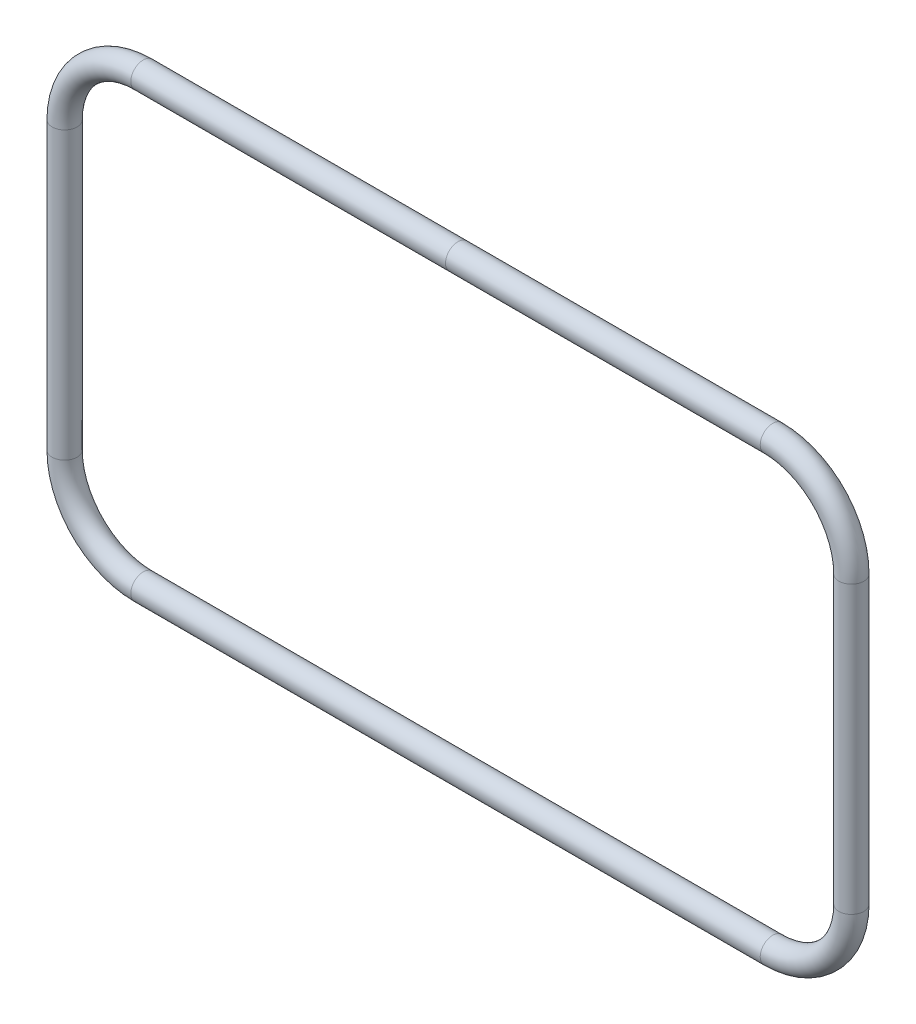
ISO-10303-21;
HEADER;
FILE_DESCRIPTION(('STEP AP214'),'2;1');
FILE_NAME('part.step','',(''),(''),'','','');
FILE_SCHEMA(('AUTOMOTIVE_DESIGN { 1 0 10303 214 1 1 1 1 }'));
ENDSEC;
DATA;
#1=APPLICATION_CONTEXT('core data for automotive mechanical design processes');
#2=APPLICATION_PROTOCOL_DEFINITION('international standard','automotive_design',2000,#1);
#3=PRODUCT_CONTEXT('',#1,'mechanical');
#4=PRODUCT('Part','Part','',(#3));
#5=PRODUCT_RELATED_PRODUCT_CATEGORY('part','',(#4));
#6=PRODUCT_DEFINITION_FORMATION('','',#4);
#7=PRODUCT_DEFINITION_CONTEXT('part definition',#1,'design');
#8=PRODUCT_DEFINITION('design','',#6,#7);
#9=PRODUCT_DEFINITION_SHAPE('','',#8);
#10=(LENGTH_UNIT() NAMED_UNIT(*) SI_UNIT(.MILLI.,.METRE.));
#11=(NAMED_UNIT(*) PLANE_ANGLE_UNIT() SI_UNIT($,.RADIAN.));
#12=(NAMED_UNIT(*) SI_UNIT($,.STERADIAN.) SOLID_ANGLE_UNIT());
#13=UNCERTAINTY_MEASURE_WITH_UNIT(LENGTH_MEASURE(1.E-05),#10,'distance_accuracy_value','');
#14=(GEOMETRIC_REPRESENTATION_CONTEXT(3) GLOBAL_UNCERTAINTY_ASSIGNED_CONTEXT((#13)) GLOBAL_UNIT_ASSIGNED_CONTEXT((#10,
#11,#12)) REPRESENTATION_CONTEXT('',''));
#15=CARTESIAN_POINT('',(0.,0.,0.));
#16=DIRECTION('',(0.,0.,1.));
#17=DIRECTION('',(1.,0.,0.));
#18=AXIS2_PLACEMENT_3D('',#15,#16,#17);
#19=CARTESIAN_POINT('',(-120.,84.525,0.));
#20=DIRECTION('',(1.,0.,0.));
#21=DIRECTION('',(0.,1.,0.));
#22=AXIS2_PLACEMENT_3D('',#19,#20,#21);
#23=CYLINDRICAL_SURFACE('',#22,4.76249999999999);
#24=CARTESIAN_POINT('',(0.,84.525,0.));
#25=DIRECTION('',(1.,0.,0.));
#26=DIRECTION('',(0.,0.,-1.));
#27=AXIS2_PLACEMENT_3D('',#24,#25,#26);
#28=CIRCLE('',#27,4.76249999999999);
#29=CARTESIAN_POINT('',(0.,84.525,-4.76249999999999));
#30=VERTEX_POINT('',#29);
#31=EDGE_CURVE('E62',#30,#30,#28,.T.);
#32=ORIENTED_EDGE('',*,*,#31,.F.);
#33=EDGE_LOOP('',(#32));
#34=FACE_BOUND('',#33,.T.);
#35=CARTESIAN_POINT('',(-120.,84.525,0.));
#36=DIRECTION('',(1.,0.,0.));
#37=DIRECTION('',(0.,0.,-1.));
#38=AXIS2_PLACEMENT_3D('',#35,#36,#37);
#39=CIRCLE('',#38,4.76249999999999);
#40=CARTESIAN_POINT('',(-120.,89.2875000000001,0.));
#41=VERTEX_POINT('',#40);
#42=EDGE_CURVE('E10',#41,#41,#39,.T.);
#43=ORIENTED_EDGE('',*,*,#42,.T.);
#44=EDGE_LOOP('',(#43));
#45=FACE_BOUND('',#44,.T.);
#46=ADVANCED_FACE('F31',(#34,#45),#23,.T.);
#47=CARTESIAN_POINT('',(-120.,54.525,0.));
#48=DIRECTION('',(0.,0.,-1.));
#49=DIRECTION('',(-1.,0.,0.));
#50=AXIS2_PLACEMENT_3D('',#47,#48,#49);
#51=TOROIDAL_SURFACE('',#50,30.,4.76249999999999);
#52=CARTESIAN_POINT('',(-150.,54.5249999999999,0.));
#53=DIRECTION('',(0.,1.,0.));
#54=DIRECTION('',(0.,0.,-1.));
#55=AXIS2_PLACEMENT_3D('',#52,#53,#54);
#56=CIRCLE('',#55,4.76249999999999);
#57=CARTESIAN_POINT('',(-154.7625,54.5249999999999,0.));
#58=VERTEX_POINT('',#57);
#59=EDGE_CURVE('E37',#58,#58,#56,.T.);
#60=CARTESIAN_POINT('',(-120.,54.525,0.));
#61=DIRECTION('',(0.,0.,-1.));
#62=DIRECTION('',(-1.,0.,0.));
#63=AXIS2_PLACEMENT_3D('',#60,#61,#62);
#64=CIRCLE('',#63,34.7625);
#65=EDGE_CURVE('',#58,#41,#64,.T.);
#66=ORIENTED_EDGE('',*,*,#59,.T.);
#67=ORIENTED_EDGE('',*,*,#42,.F.);
#68=ORIENTED_EDGE('',*,*,#65,.T.);
#69=ORIENTED_EDGE('',*,*,#65,.F.);
#70=EDGE_LOOP('',(#66,#68,#67,#69));
#71=FACE_BOUND('',#70,.T.);
#72=ADVANCED_FACE('F69',(#71),#51,.T.);
#73=CARTESIAN_POINT('',(-150.,-54.5250000000001,0.));
#74=DIRECTION('',(0.,1.,0.));
#75=DIRECTION('',(0.,0.,1.));
#76=AXIS2_PLACEMENT_3D('',#73,#74,#75);
#77=CYLINDRICAL_SURFACE('',#76,4.76249999999999);
#78=ORIENTED_EDGE('',*,*,#59,.F.);
#79=EDGE_LOOP('',(#78));
#80=FACE_BOUND('',#79,.T.);
#81=CARTESIAN_POINT('',(-150.,-54.5250000000001,0.));
#82=DIRECTION('',(0.,1.,0.));
#83=DIRECTION('',(0.,0.,-1.));
#84=AXIS2_PLACEMENT_3D('',#81,#82,#83);
#85=CIRCLE('',#84,4.76249999999999);
#86=CARTESIAN_POINT('',(-154.7625,-54.5250000000001,0.));
#87=VERTEX_POINT('',#86);
#88=EDGE_CURVE('E41',#87,#87,#85,.T.);
#89=ORIENTED_EDGE('',*,*,#88,.T.);
#90=EDGE_LOOP('',(#89));
#91=FACE_BOUND('',#90,.T.);
#92=ADVANCED_FACE('F73',(#80,#91),#77,.T.);
#93=CARTESIAN_POINT('',(-120.,-54.525,0.));
#94=DIRECTION('',(0.,0.,-1.));
#95=DIRECTION('',(-1.,0.,0.));
#96=AXIS2_PLACEMENT_3D('',#93,#94,#95);
#97=TOROIDAL_SURFACE('',#96,30.,4.76249999999999);
#98=CARTESIAN_POINT('',(-120.,-84.525,0.));
#99=DIRECTION('',(-1.,0.,0.));
#100=DIRECTION('',(0.,0.,-1.));
#101=AXIS2_PLACEMENT_3D('',#98,#99,#100);
#102=CIRCLE('',#101,4.76249999999999);
#103=CARTESIAN_POINT('',(-120.,-89.2875,0.));
#104=VERTEX_POINT('',#103);
#105=EDGE_CURVE('E45',#104,#104,#102,.T.);
#106=CARTESIAN_POINT('',(-120.,-54.525,0.));
#107=DIRECTION('',(0.,0.,-1.));
#108=DIRECTION('',(-1.,0.,0.));
#109=AXIS2_PLACEMENT_3D('',#106,#107,#108);
#110=CIRCLE('',#109,34.7625);
#111=EDGE_CURVE('',#104,#87,#110,.T.);
#112=ORIENTED_EDGE('',*,*,#105,.T.);
#113=ORIENTED_EDGE('',*,*,#88,.F.);
#114=ORIENTED_EDGE('',*,*,#111,.T.);
#115=ORIENTED_EDGE('',*,*,#111,.F.);
#116=EDGE_LOOP('',(#112,#114,#113,#115));
#117=FACE_BOUND('',#116,.T.);
#118=ADVANCED_FACE('F78',(#117),#97,.T.);
#119=CARTESIAN_POINT('',(120.,-84.525,0.));
#120=DIRECTION('',(-1.,0.,0.));
#121=DIRECTION('',(0.,-1.,0.));
#122=AXIS2_PLACEMENT_3D('',#119,#120,#121);
#123=CYLINDRICAL_SURFACE('',#122,4.76249999999999);
#124=CARTESIAN_POINT('',(120.,-84.5249999999999,0.));
#125=DIRECTION('',(-1.,0.,0.));
#126=DIRECTION('',(0.,0.,-1.));
#127=AXIS2_PLACEMENT_3D('',#124,#125,#126);
#128=CIRCLE('',#127,4.76249999999999);
#129=CARTESIAN_POINT('',(120.,-89.2875,0.));
#130=VERTEX_POINT('',#129);
#131=EDGE_CURVE('E50',#130,#130,#128,.T.);
#132=CARTESIAN_POINT('',(-120.,-89.2875,0.));
#133=CARTESIAN_POINT('',(-117.5,-89.2875,0.));
#134=CARTESIAN_POINT('',(-115.,-89.2875,0.));
#135=CARTESIAN_POINT('',(-110.,-89.2875,0.));
#136=CARTESIAN_POINT('',(-107.5,-89.2875,0.));
#137=CARTESIAN_POINT('',(-102.5,-89.2875,0.));
#138=CARTESIAN_POINT('',(-99.9999999999999,-89.2875,0.));
#139=CARTESIAN_POINT('',(-94.9999999999999,-89.2875,0.));
#140=CARTESIAN_POINT('',(-92.4999999999999,-89.2875,0.));
#141=CARTESIAN_POINT('',(-87.4999999999999,-89.2875,0.));
#142=CARTESIAN_POINT('',(-84.9999999999999,-89.2875,0.));
#143=CARTESIAN_POINT('',(-79.9999999999999,-89.2875,0.));
#144=CARTESIAN_POINT('',(-77.4999999999999,-89.2875,0.));
#145=CARTESIAN_POINT('',(-72.4999999999999,-89.2875,0.));
#146=CARTESIAN_POINT('',(-69.9999999999999,-89.2875,0.));
#147=CARTESIAN_POINT('',(-64.9999999999999,-89.2875,0.));
#148=CARTESIAN_POINT('',(-62.4999999999999,-89.2875,0.));
#149=CARTESIAN_POINT('',(-57.4999999999999,-89.2875,0.));
#150=CARTESIAN_POINT('',(-54.9999999999999,-89.2875,0.));
#151=CARTESIAN_POINT('',(-49.9999999999999,-89.2875,0.));
#152=CARTESIAN_POINT('',(-47.4999999999999,-89.2875,0.));
#153=CARTESIAN_POINT('',(-42.4999999999999,-89.2875,0.));
#154=CARTESIAN_POINT('',(-39.9999999999999,-89.2875,0.));
#155=CARTESIAN_POINT('',(-35.,-89.2875,0.));
#156=CARTESIAN_POINT('',(-32.4999999999999,-89.2875,0.));
#157=CARTESIAN_POINT('',(-27.4999999999999,-89.2875,0.));
#158=CARTESIAN_POINT('',(-24.9999999999999,-89.2875,0.));
#159=CARTESIAN_POINT('',(-19.9999999999999,-89.2875,0.));
#160=CARTESIAN_POINT('',(-17.4999999999999,-89.2875,0.));
#161=CARTESIAN_POINT('',(-12.4999999999999,-89.2875,0.));
#162=CARTESIAN_POINT('',(-9.99999999999993,-89.2875,0.));
#163=CARTESIAN_POINT('',(-4.99999999999994,-89.2875,0.));
#164=CARTESIAN_POINT('',(-2.49999999999995,-89.2875,0.));
#165=CARTESIAN_POINT('',(2.50000000000004,-89.2875,0.));
#166=CARTESIAN_POINT('',(5.00000000000005,-89.2875,0.));
#167=CARTESIAN_POINT('',(10.,-89.2875,0.));
#168=CARTESIAN_POINT('',(12.5,-89.2875,0.));
#169=CARTESIAN_POINT('',(17.5,-89.2875,0.));
#170=CARTESIAN_POINT('',(20.,-89.2875,0.));
#171=CARTESIAN_POINT('',(25.,-89.2875,0.));
#172=CARTESIAN_POINT('',(27.5,-89.2875,0.));
#173=CARTESIAN_POINT('',(32.5,-89.2875,0.));
#174=CARTESIAN_POINT('',(35.,-89.2875,0.));
#175=CARTESIAN_POINT('',(40.,-89.2875,0.));
#176=CARTESIAN_POINT('',(42.5,-89.2875,0.));
#177=CARTESIAN_POINT('',(47.5,-89.2875,0.));
#178=CARTESIAN_POINT('',(50.,-89.2875,0.));
#179=CARTESIAN_POINT('',(55.,-89.2875,0.));
#180=CARTESIAN_POINT('',(57.5,-89.2875,0.));
#181=CARTESIAN_POINT('',(62.5,-89.2875,0.));
#182=CARTESIAN_POINT('',(65.,-89.2875,0.));
#183=CARTESIAN_POINT('',(70.,-89.2875,0.));
#184=CARTESIAN_POINT('',(72.5,-89.2875,0.));
#185=CARTESIAN_POINT('',(77.5,-89.2875,0.));
#186=CARTESIAN_POINT('',(80.,-89.2875,0.));
#187=CARTESIAN_POINT('',(85.,-89.2875,0.));
#188=CARTESIAN_POINT('',(87.5,-89.2875,0.));
#189=CARTESIAN_POINT('',(92.5,-89.2875,0.));
#190=CARTESIAN_POINT('',(95.,-89.2875,0.));
#191=CARTESIAN_POINT('',(100.,-89.2875,0.));
#192=CARTESIAN_POINT('',(102.5,-89.2875,0.));
#193=CARTESIAN_POINT('',(107.5,-89.2875,0.));
#194=CARTESIAN_POINT('',(110.,-89.2875,0.));
#195=CARTESIAN_POINT('',(115.,-89.2875,0.));
#196=CARTESIAN_POINT('',(117.5,-89.2875,0.));
#197=CARTESIAN_POINT('',(120.,-89.2875,0.));
#198=B_SPLINE_CURVE_WITH_KNOTS('',3,(#132,#133,#134,#135,#136,#137,#138,#139,#140,#141,#142,
#143,#144,#145,#146,#147,#148,#149,#150,#151,#152,#153,#154,#155,#156,#157,#158,#159,#160,#161,
#162,#163,#164,#165,#166,#167,#168,#169,#170,#171,#172,#173,#174,#175,#176,#177,#178,#179,#180,
#181,#182,#183,#184,#185,#186,#187,#188,#189,#190,#191,#192,#193,#194,#195,#196,#197),
.UNSPECIFIED.,.F.,.F.,(4,2,2,2,2,2,2,2,2,2,2,2,2,2,2,2,2,2,2,2,2,2,2,2,2,2,2,2,2,2,2,2,4),(0.,
7.50000000000001,15.,22.5,30.,37.5,45.,52.5,60.,67.5,75.,82.5,90.,97.5,105.,112.5,120.,127.5,
135.,142.5,150.,157.5,165.,172.5,180.,187.5,195.,202.5,210.,217.5,225.,232.5,240.),.UNSPECIFIED.);
#199=EDGE_CURVE('BSEAM84',#104,#130,#198,.T.);
#200=ORIENTED_EDGE('',*,*,#105,.F.);
#201=ORIENTED_EDGE('',*,*,#131,.T.);
#202=ORIENTED_EDGE('',*,*,#199,.T.);
#203=ORIENTED_EDGE('',*,*,#199,.F.);
#204=EDGE_LOOP('',(#200,#202,#201,#203));
#205=FACE_BOUND('',#204,.T.);
#206=ADVANCED_FACE('F84',(#205),#123,.T.);
#207=CARTESIAN_POINT('',(120.,-54.525,0.));
#208=DIRECTION('',(0.,0.,-1.));
#209=DIRECTION('',(-1.,0.,0.));
#210=AXIS2_PLACEMENT_3D('',#207,#208,#209);
#211=TOROIDAL_SURFACE('',#210,30.,4.76249999999999);
#212=CARTESIAN_POINT('',(150.,-54.5249999999999,0.));
#213=DIRECTION('',(0.,-1.,0.));
#214=DIRECTION('',(0.,0.,-1.));
#215=AXIS2_PLACEMENT_3D('',#212,#213,#214);
#216=CIRCLE('',#215,4.76249999999999);
#217=CARTESIAN_POINT('',(154.7625,-54.5249999999999,0.));
#218=VERTEX_POINT('',#217);
#219=EDGE_CURVE('E53',#218,#218,#216,.T.);
#220=CARTESIAN_POINT('',(120.,-54.525,0.));
#221=DIRECTION('',(0.,0.,-1.));
#222=DIRECTION('',(-1.,0.,0.));
#223=AXIS2_PLACEMENT_3D('',#220,#221,#222);
#224=CIRCLE('',#223,34.7625);
#225=EDGE_CURVE('',#218,#130,#224,.T.);
#226=ORIENTED_EDGE('',*,*,#219,.T.);
#227=ORIENTED_EDGE('',*,*,#131,.F.);
#228=ORIENTED_EDGE('',*,*,#225,.T.);
#229=ORIENTED_EDGE('',*,*,#225,.F.);
#230=EDGE_LOOP('',(#226,#228,#227,#229));
#231=FACE_BOUND('',#230,.T.);
#232=ADVANCED_FACE('F88',(#231),#211,.T.);
#233=CARTESIAN_POINT('',(150.,54.5250000000001,0.));
#234=DIRECTION('',(0.,-1.,0.));
#235=DIRECTION('',(0.,0.,-1.));
#236=AXIS2_PLACEMENT_3D('',#233,#234,#235);
#237=CYLINDRICAL_SURFACE('',#236,4.76249999999999);
#238=ORIENTED_EDGE('',*,*,#219,.F.);
#239=EDGE_LOOP('',(#238));
#240=FACE_BOUND('',#239,.T.);
#241=CARTESIAN_POINT('',(150.,54.5250000000001,0.));
#242=DIRECTION('',(0.,-1.,0.));
#243=DIRECTION('',(0.,0.,-1.));
#244=AXIS2_PLACEMENT_3D('',#241,#242,#243);
#245=CIRCLE('',#244,4.76249999999999);
#246=CARTESIAN_POINT('',(154.7625,54.5250000000001,0.));
#247=VERTEX_POINT('',#246);
#248=EDGE_CURVE('E56',#247,#247,#245,.T.);
#249=ORIENTED_EDGE('',*,*,#248,.T.);
#250=EDGE_LOOP('',(#249));
#251=FACE_BOUND('',#250,.T.);
#252=ADVANCED_FACE('F92',(#240,#251),#237,.T.);
#253=CARTESIAN_POINT('',(120.,54.525,0.));
#254=DIRECTION('',(0.,0.,-1.));
#255=DIRECTION('',(-1.,0.,0.));
#256=AXIS2_PLACEMENT_3D('',#253,#254,#255);
#257=TOROIDAL_SURFACE('',#256,30.,4.76249999999999);
#258=CARTESIAN_POINT('',(120.,84.525,0.));
#259=DIRECTION('',(1.,0.,0.));
#260=DIRECTION('',(0.,0.,-1.));
#261=AXIS2_PLACEMENT_3D('',#258,#259,#260);
#262=CIRCLE('',#261,4.76249999999999);
#263=CARTESIAN_POINT('',(120.,89.2875,0.));
#264=VERTEX_POINT('',#263);
#265=EDGE_CURVE('E59',#264,#264,#262,.T.);
#266=CARTESIAN_POINT('',(120.,54.525,0.));
#267=DIRECTION('',(0.,0.,-1.));
#268=DIRECTION('',(-1.,0.,0.));
#269=AXIS2_PLACEMENT_3D('',#266,#267,#268);
#270=CIRCLE('',#269,34.7625);
#271=EDGE_CURVE('',#264,#247,#270,.T.);
#272=ORIENTED_EDGE('',*,*,#265,.T.);
#273=ORIENTED_EDGE('',*,*,#248,.F.);
#274=ORIENTED_EDGE('',*,*,#271,.T.);
#275=ORIENTED_EDGE('',*,*,#271,.F.);
#276=EDGE_LOOP('',(#272,#274,#273,#275));
#277=FACE_BOUND('',#276,.T.);
#278=ADVANCED_FACE('F96',(#277),#257,.T.);
#279=CARTESIAN_POINT('',(0.,84.525,0.));
#280=DIRECTION('',(1.,0.,0.));
#281=DIRECTION('',(0.,1.,0.));
#282=AXIS2_PLACEMENT_3D('',#279,#280,#281);
#283=CYLINDRICAL_SURFACE('',#282,4.76249999999999);
#284=ORIENTED_EDGE('',*,*,#265,.F.);
#285=EDGE_LOOP('',(#284));
#286=FACE_BOUND('',#285,.T.);
#287=ORIENTED_EDGE('',*,*,#31,.T.);
#288=EDGE_LOOP('',(#287));
#289=FACE_BOUND('',#288,.T.);
#290=ADVANCED_FACE('F66',(#286,#289),#283,.T.);
#291=CLOSED_SHELL('',(#46,#72,#92,#118,#206,#232,#252,#278,#290));
#292=MANIFOLD_SOLID_BREP('B2',#291);
#293=ADVANCED_BREP_SHAPE_REPRESENTATION('',(#18,#292),#14);
#294=SHAPE_DEFINITION_REPRESENTATION(#9,#293);
ENDSEC;
END-ISO-10303-21;
